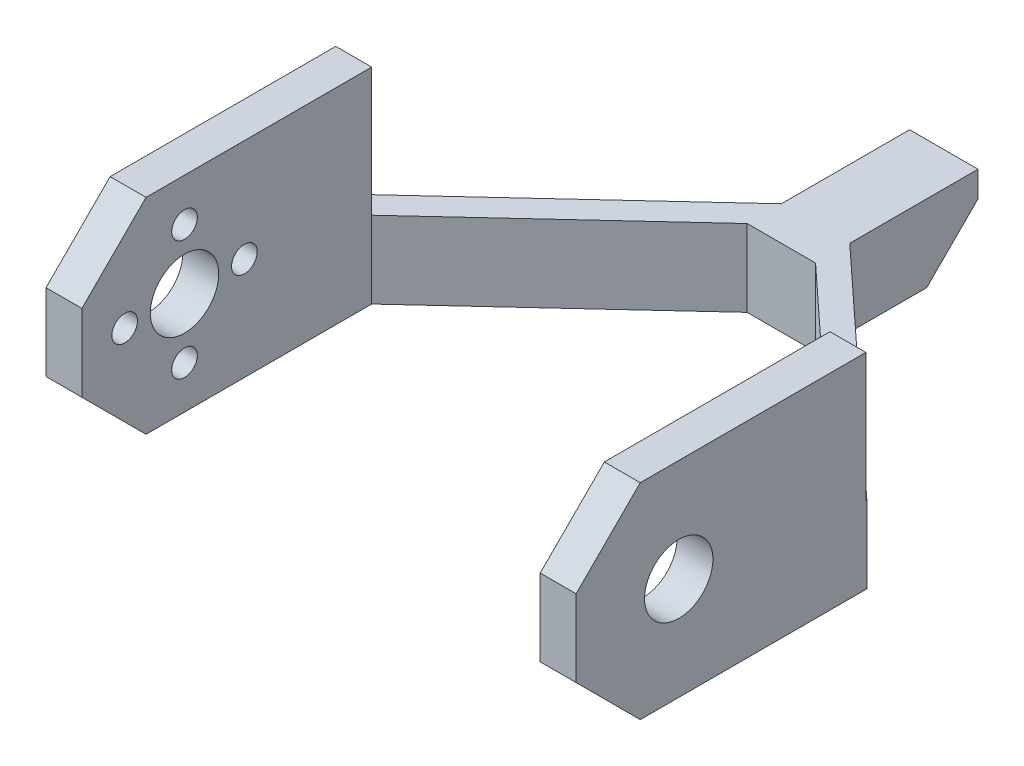
ISO-10303-21;
HEADER;
FILE_DESCRIPTION(('STEP AP214'),'2;1');
FILE_NAME('part.step','',(''),(''),'','','');
FILE_SCHEMA(('AUTOMOTIVE_DESIGN { 1 0 10303 214 1 1 1 1 }'));
ENDSEC;
DATA;
#1=APPLICATION_CONTEXT('core data for automotive mechanical design processes');
#2=APPLICATION_PROTOCOL_DEFINITION('international standard','automotive_design',2000,#1);
#3=PRODUCT_CONTEXT('',#1,'mechanical');
#4=PRODUCT('Part','Part','',(#3));
#5=PRODUCT_RELATED_PRODUCT_CATEGORY('part','',(#4));
#6=PRODUCT_DEFINITION_FORMATION('','',#4);
#7=PRODUCT_DEFINITION_CONTEXT('part definition',#1,'design');
#8=PRODUCT_DEFINITION('design','',#6,#7);
#9=PRODUCT_DEFINITION_SHAPE('','',#8);
#10=(LENGTH_UNIT() NAMED_UNIT(*) SI_UNIT(.MILLI.,.METRE.));
#11=(NAMED_UNIT(*) PLANE_ANGLE_UNIT() SI_UNIT($,.RADIAN.));
#12=(NAMED_UNIT(*) SI_UNIT($,.STERADIAN.) SOLID_ANGLE_UNIT());
#13=UNCERTAINTY_MEASURE_WITH_UNIT(LENGTH_MEASURE(1.E-05),#10,'distance_accuracy_value','');
#14=(GEOMETRIC_REPRESENTATION_CONTEXT(3) GLOBAL_UNCERTAINTY_ASSIGNED_CONTEXT((#13)) GLOBAL_UNIT_ASSIGNED_CONTEXT((#10,
#11,#12)) REPRESENTATION_CONTEXT('',''));
#15=CARTESIAN_POINT('',(0.,0.,0.));
#16=DIRECTION('',(0.,0.,1.));
#17=DIRECTION('',(1.,0.,0.));
#18=AXIS2_PLACEMENT_3D('',#15,#16,#17);
#19=CARTESIAN_POINT('',(-62.,12.,12.));
#20=DIRECTION('',(0.,1.,0.));
#21=DIRECTION('',(0.,0.,1.));
#22=AXIS2_PLACEMENT_3D('',#19,#20,#21);
#23=PLANE('',#22);
#24=DIRECTION('',(1.,0.,0.));
#25=VECTOR('',#24,1.);
#26=CARTESIAN_POINT('',(-57.8,12.,-21.8888888888889));
#27=LINE('',#26,#25);
#28=CARTESIAN_POINT('',(-62.,12.,-21.8888888888889));
#29=VERTEX_POINT('',#28);
#30=CARTESIAN_POINT('',(-57.8,12.,-21.8888888888889));
#31=VERTEX_POINT('',#30);
#32=EDGE_CURVE('E190',#29,#31,#27,.T.);
#33=ORIENTED_EDGE('',*,*,#32,.F.);
#34=DIRECTION('',(0.,0.,1.));
#35=VECTOR('',#34,1.);
#36=CARTESIAN_POINT('',(-62.,12.,-47.));
#37=LINE('',#36,#35);
#38=CARTESIAN_POINT('',(-62.,12.,4.50000000000001));
#39=VERTEX_POINT('',#38);
#40=EDGE_CURVE('E249',#29,#39,#37,.T.);
#41=ORIENTED_EDGE('',*,*,#40,.T.);
#42=DIRECTION('',(1.,0.,0.));
#43=VECTOR('',#42,1.);
#44=CARTESIAN_POINT('',(-62.,12.,4.50000000000001));
#45=LINE('',#44,#43);
#46=CARTESIAN_POINT('',(-57.8,12.,4.50000000000001));
#47=VERTEX_POINT('',#46);
#48=EDGE_CURVE('E274',#39,#47,#45,.T.);
#49=ORIENTED_EDGE('',*,*,#48,.T.);
#50=DIRECTION('',(0.,0.,1.));
#51=VECTOR('',#50,1.);
#52=CARTESIAN_POINT('',(-57.8,12.,12.));
#53=LINE('',#52,#51);
#54=EDGE_CURVE('E237',#31,#47,#53,.T.);
#55=ORIENTED_EDGE('',*,*,#54,.F.);
#56=EDGE_LOOP('',(#33,#41,#49,#55));
#57=FACE_BOUND('',#56,.T.);
#58=ADVANCED_FACE('F37',(#57),#23,.T.);
#59=CARTESIAN_POINT('',(-62.,12.,12.));
#60=DIRECTION('',(0.,0.,1.));
#61=DIRECTION('',(1.,0.,0.));
#62=AXIS2_PLACEMENT_3D('',#59,#60,#61);
#63=PLANE('',#62);
#64=DIRECTION('',(0.,1.,0.));
#65=VECTOR('',#64,1.);
#66=CARTESIAN_POINT('',(-57.8,-12.001,12.));
#67=LINE('',#66,#65);
#68=CARTESIAN_POINT('',(-57.8,-4.49999999999999,12.));
#69=VERTEX_POINT('',#68);
#70=CARTESIAN_POINT('',(-57.8,4.49999999999999,12.));
#71=VERTEX_POINT('',#70);
#72=EDGE_CURVE('E220',#69,#71,#67,.T.);
#73=ORIENTED_EDGE('',*,*,#72,.T.);
#74=DIRECTION('',(-1.,0.,0.));
#75=VECTOR('',#74,1.);
#76=CARTESIAN_POINT('',(-62.,4.5,12.));
#77=LINE('',#76,#75);
#78=CARTESIAN_POINT('',(-62.,4.5,12.));
#79=VERTEX_POINT('',#78);
#80=EDGE_CURVE('E301',#71,#79,#77,.T.);
#81=ORIENTED_EDGE('',*,*,#80,.T.);
#82=DIRECTION('',(0.,-1.,0.));
#83=VECTOR('',#82,1.);
#84=CARTESIAN_POINT('',(-62.,12.,12.));
#85=LINE('',#84,#83);
#86=CARTESIAN_POINT('',(-62.,-4.49999999999999,12.));
#87=VERTEX_POINT('',#86);
#88=EDGE_CURVE('E373',#79,#87,#85,.T.);
#89=ORIENTED_EDGE('',*,*,#88,.T.);
#90=DIRECTION('',(1.,0.,0.));
#91=VECTOR('',#90,1.);
#92=CARTESIAN_POINT('',(-62.,-4.5,12.));
#93=LINE('',#92,#91);
#94=EDGE_CURVE('E298',#87,#69,#93,.T.);
#95=ORIENTED_EDGE('',*,*,#94,.T.);
#96=EDGE_LOOP('',(#73,#81,#89,#95));
#97=FACE_BOUND('',#96,.T.);
#98=ADVANCED_FACE('F372',(#97),#63,.T.);
#99=CARTESIAN_POINT('',(-62.,-12.,-12.));
#100=DIRECTION('',(0.,-1.,0.));
#101=DIRECTION('',(0.,0.,-1.));
#102=AXIS2_PLACEMENT_3D('',#99,#100,#101);
#103=PLANE('',#102);
#104=DIRECTION('',(0.,0.,1.));
#105=VECTOR('',#104,1.);
#106=CARTESIAN_POINT('',(-35.,-12.,-47.));
#107=LINE('',#106,#105);
#108=CARTESIAN_POINT('',(-35.,-12.,-56.));
#109=VERTEX_POINT('',#108);
#110=CARTESIAN_POINT('',(-35.,-12.,-47.));
#111=VERTEX_POINT('',#110);
#112=EDGE_CURVE('E336',#109,#111,#107,.T.);
#113=ORIENTED_EDGE('',*,*,#112,.F.);
#114=DIRECTION('',(1.,0.,0.));
#115=VECTOR('',#114,1.);
#116=CARTESIAN_POINT('',(-62.,-12.,-56.));
#117=LINE('',#116,#115);
#118=CARTESIAN_POINT('',(-27.,-12.,-56.));
#119=VERTEX_POINT('',#118);
#120=EDGE_CURVE('E45',#109,#119,#117,.T.);
#121=ORIENTED_EDGE('',*,*,#120,.T.);
#122=DIRECTION('',(0.,0.,-1.));
#123=VECTOR('',#122,1.);
#124=CARTESIAN_POINT('',(-27.,-12.,-47.));
#125=LINE('',#124,#123);
#126=CARTESIAN_POINT('',(-27.,-12.,-47.));
#127=VERTEX_POINT('',#126);
#128=EDGE_CURVE('E340',#127,#119,#125,.T.);
#129=ORIENTED_EDGE('',*,*,#128,.F.);
#130=DIRECTION('',(0.733760674018169,0.,0.679408031498305));
#131=VECTOR('',#130,1.);
#132=CARTESIAN_POINT('',(-27.,-12.,-47.));
#133=LINE('',#132,#131);
#134=CARTESIAN_POINT('',(0.,-12.,-22.));
#135=VERTEX_POINT('',#134);
#136=EDGE_CURVE('E338',#127,#135,#133,.T.);
#137=ORIENTED_EDGE('',*,*,#136,.T.);
#138=DIRECTION('',(0.,0.,-1.));
#139=VECTOR('',#138,1.);
#140=CARTESIAN_POINT('',(0.,-12.,-12.));
#141=LINE('',#140,#139);
#142=CARTESIAN_POINT('',(0.,-12.,4.49999999999997));
#143=VERTEX_POINT('',#142);
#144=EDGE_CURVE('E380',#143,#135,#141,.T.);
#145=ORIENTED_EDGE('',*,*,#144,.F.);
#146=DIRECTION('',(-1.,0.,0.));
#147=VECTOR('',#146,1.);
#148=CARTESIAN_POINT('',(-62.,-12.,4.49999999999997));
#149=LINE('',#148,#147);
#150=CARTESIAN_POINT('',(-4.2,-12.,4.49999999999997));
#151=VERTEX_POINT('',#150);
#152=EDGE_CURVE('E310',#143,#151,#149,.T.);
#153=ORIENTED_EDGE('',*,*,#152,.T.);
#154=DIRECTION('',(0.,0.,-1.));
#155=VECTOR('',#154,1.);
#156=CARTESIAN_POINT('',(-4.2,-12.,-21.8888888888889));
#157=LINE('',#156,#155);
#158=CARTESIAN_POINT('',(-4.2,-12.,-21.8888888888889));
#159=VERTEX_POINT('',#158);
#160=EDGE_CURVE('E223',#151,#159,#157,.T.);
#161=ORIENTED_EDGE('',*,*,#160,.T.);
#162=DIRECTION('',(-0.73376067401817,0.,-0.679408031498305));
#163=VECTOR('',#162,1.);
#164=CARTESIAN_POINT('',(-27.,-12.,-43.));
#165=LINE('',#164,#163);
#166=CARTESIAN_POINT('',(-27.,-12.,-43.));
#167=VERTEX_POINT('',#166);
#168=EDGE_CURVE('E350',#159,#167,#165,.T.);
#169=ORIENTED_EDGE('',*,*,#168,.T.);
#170=DIRECTION('',(-1.,0.,0.));
#171=VECTOR('',#170,1.);
#172=CARTESIAN_POINT('',(-35.,-12.,-43.));
#173=LINE('',#172,#171);
#174=CARTESIAN_POINT('',(-35.,-12.,-43.));
#175=VERTEX_POINT('',#174);
#176=EDGE_CURVE('E353',#167,#175,#173,.T.);
#177=ORIENTED_EDGE('',*,*,#176,.T.);
#178=DIRECTION('',(-0.733760674018169,0.,0.679408031498305));
#179=VECTOR('',#178,1.);
#180=CARTESIAN_POINT('',(-35.,-12.,-43.));
#181=LINE('',#180,#179);
#182=CARTESIAN_POINT('',(-57.8,-12.,-21.8888888888889));
#183=VERTEX_POINT('',#182);
#184=EDGE_CURVE('E356',#175,#183,#181,.T.);
#185=ORIENTED_EDGE('',*,*,#184,.T.);
#186=DIRECTION('',(0.,0.,1.));
#187=VECTOR('',#186,1.);
#188=CARTESIAN_POINT('',(-57.8,-12.,12.));
#189=LINE('',#188,#187);
#190=CARTESIAN_POINT('',(-57.8,-12.,4.49999999999997));
#191=VERTEX_POINT('',#190);
#192=EDGE_CURVE('E219',#183,#191,#189,.T.);
#193=ORIENTED_EDGE('',*,*,#192,.T.);
#194=DIRECTION('',(-1.,0.,0.));
#195=VECTOR('',#194,1.);
#196=CARTESIAN_POINT('',(-62.,-12.,4.49999999999997));
#197=LINE('',#196,#195);
#198=CARTESIAN_POINT('',(-62.,-12.,4.49999999999997));
#199=VERTEX_POINT('',#198);
#200=EDGE_CURVE('E308',#191,#199,#197,.T.);
#201=ORIENTED_EDGE('',*,*,#200,.T.);
#202=DIRECTION('',(0.,0.,-1.));
#203=VECTOR('',#202,1.);
#204=CARTESIAN_POINT('',(-62.,-12.,12.));
#205=LINE('',#204,#203);
#206=CARTESIAN_POINT('',(-62.,-12.,-22.));
#207=VERTEX_POINT('',#206);
#208=EDGE_CURVE('E278',#199,#207,#205,.T.);
#209=ORIENTED_EDGE('',*,*,#208,.T.);
#210=DIRECTION('',(0.733760674018169,0.,-0.679408031498305));
#211=VECTOR('',#210,1.);
#212=CARTESIAN_POINT('',(-35.,-12.,-47.));
#213=LINE('',#212,#211);
#214=EDGE_CURVE('E239',#207,#111,#213,.T.);
#215=ORIENTED_EDGE('',*,*,#214,.T.);
#216=EDGE_LOOP('',(#113,#121,#129,#137,#145,#153,#161,#169,#177,#185,#193,#201,#209,#215));
#217=FACE_BOUND('',#216,.T.);
#218=ADVANCED_FACE('F396',(#217),#103,.T.);
#219=DIRECTION('',(0.,-1.,0.));
#220=VECTOR('',#219,1.);
#221=CARTESIAN_POINT('',(0.,12.,12.));
#222=LINE('',#221,#220);
#223=CARTESIAN_POINT('',(0.,4.5,12.));
#224=VERTEX_POINT('',#223);
#225=CARTESIAN_POINT('',(0.,-4.49999999999999,12.));
#226=VERTEX_POINT('',#225);
#227=EDGE_CURVE('E383',#224,#226,#222,.T.);
#228=ORIENTED_EDGE('',*,*,#227,.F.);
#229=DIRECTION('',(-1.,0.,0.));
#230=VECTOR('',#229,1.);
#231=CARTESIAN_POINT('',(-62.,4.5,12.));
#232=LINE('',#231,#230);
#233=CARTESIAN_POINT('',(-4.19999999999999,4.49999999999998,12.));
#234=VERTEX_POINT('',#233);
#235=EDGE_CURVE('E288',#224,#234,#232,.T.);
#236=ORIENTED_EDGE('',*,*,#235,.T.);
#237=DIRECTION('',(0.,1.,0.));
#238=VECTOR('',#237,1.);
#239=CARTESIAN_POINT('',(-4.2,-12.001,12.));
#240=LINE('',#239,#238);
#241=CARTESIAN_POINT('',(-4.2,-4.49999999999999,12.));
#242=VERTEX_POINT('',#241);
#243=EDGE_CURVE('E234',#242,#234,#240,.T.);
#244=ORIENTED_EDGE('',*,*,#243,.F.);
#245=DIRECTION('',(1.,0.,0.));
#246=VECTOR('',#245,1.);
#247=CARTESIAN_POINT('',(-62.,-4.5,12.));
#248=LINE('',#247,#246);
#249=EDGE_CURVE('E285',#242,#226,#248,.T.);
#250=ORIENTED_EDGE('',*,*,#249,.T.);
#251=EDGE_LOOP('',(#228,#236,#244,#250));
#252=FACE_BOUND('',#251,.T.);
#253=ADVANCED_FACE('F466',(#252),#63,.T.);
#254=DIRECTION('',(1.,0.,0.));
#255=VECTOR('',#254,1.);
#256=CARTESIAN_POINT('',(-4.2,12.,-21.8888888888889));
#257=LINE('',#256,#255);
#258=CARTESIAN_POINT('',(-4.2,12.,-21.8888888888889));
#259=VERTEX_POINT('',#258);
#260=CARTESIAN_POINT('',(0.,12.,-21.8888888888889));
#261=VERTEX_POINT('',#260);
#262=EDGE_CURVE('E205',#259,#261,#257,.T.);
#263=ORIENTED_EDGE('',*,*,#262,.F.);
#264=DIRECTION('',(0.,0.,-1.));
#265=VECTOR('',#264,1.);
#266=CARTESIAN_POINT('',(-4.2,12.,-21.8888888888889));
#267=LINE('',#266,#265);
#268=CARTESIAN_POINT('',(-4.2,12.,4.5));
#269=VERTEX_POINT('',#268);
#270=EDGE_CURVE('E359',#269,#259,#267,.T.);
#271=ORIENTED_EDGE('',*,*,#270,.F.);
#272=DIRECTION('',(1.,0.,0.));
#273=VECTOR('',#272,1.);
#274=CARTESIAN_POINT('',(-62.,12.,4.50000000000001));
#275=LINE('',#274,#273);
#276=CARTESIAN_POINT('',(0.,12.,4.50000000000001));
#277=VERTEX_POINT('',#276);
#278=EDGE_CURVE('E277',#269,#277,#275,.T.);
#279=ORIENTED_EDGE('',*,*,#278,.T.);
#280=DIRECTION('',(0.,0.,1.));
#281=VECTOR('',#280,1.);
#282=CARTESIAN_POINT('',(0.,12.,12.));
#283=LINE('',#282,#281);
#284=EDGE_CURVE('E246',#261,#277,#283,.T.);
#285=ORIENTED_EDGE('',*,*,#284,.F.);
#286=EDGE_LOOP('',(#263,#271,#279,#285));
#287=FACE_BOUND('',#286,.T.);
#288=ADVANCED_FACE('F458',(#287),#23,.T.);
#289=CARTESIAN_POINT('',(-62.,0.,0.));
#290=DIRECTION('',(1.,0.,0.));
#291=DIRECTION('',(0.,0.,-1.));
#292=AXIS2_PLACEMENT_3D('',#289,#290,#291);
#293=PLANE('',#292);
#294=CARTESIAN_POINT('',(-62.,-1.98951966012828E-13,-6.9999999999998));
#295=DIRECTION('',(-1.,0.,0.));
#296=DIRECTION('',(0.,0.,1.));
#297=AXIS2_PLACEMENT_3D('',#294,#295,#296);
#298=CIRCLE('',#297,1.50000000000032);
#299=CARTESIAN_POINT('',(-62.,-1.98951966012828E-13,-5.49999999999948));
#300=VERTEX_POINT('',#299);
#301=EDGE_CURVE('E430',#300,#300,#298,.T.);
#302=ORIENTED_EDGE('',*,*,#301,.F.);
#303=EDGE_LOOP('',(#302));
#304=FACE_BOUND('',#303,.T.);
#305=CARTESIAN_POINT('',(-62.,-7.,3.9618942650685E-13));
#306=DIRECTION('',(-1.,0.,0.));
#307=DIRECTION('',(0.,0.,1.));
#308=AXIS2_PLACEMENT_3D('',#305,#306,#307);
#309=CIRCLE('',#308,1.50000000000043);
#310=CARTESIAN_POINT('',(-62.,-7.,1.50000000000082));
#311=VERTEX_POINT('',#310);
#312=EDGE_CURVE('E424',#311,#311,#309,.T.);
#313=ORIENTED_EDGE('',*,*,#312,.F.);
#314=EDGE_LOOP('',(#313));
#315=FACE_BOUND('',#314,.T.);
#316=CARTESIAN_POINT('',(-62.,1.98094713253425E-13,7.0000000000002));
#317=DIRECTION('',(-1.,0.,0.));
#318=DIRECTION('',(0.,0.,1.));
#319=AXIS2_PLACEMENT_3D('',#316,#317,#318);
#320=CIRCLE('',#319,1.50000000000015);
#321=CARTESIAN_POINT('',(-62.,1.98094713253425E-13,8.50000000000035));
#322=VERTEX_POINT('',#321);
#323=EDGE_CURVE('E418',#322,#322,#320,.T.);
#324=ORIENTED_EDGE('',*,*,#323,.F.);
#325=EDGE_LOOP('',(#324));
#326=FACE_BOUND('',#325,.T.);
#327=CARTESIAN_POINT('',(-62.,7.,0.));
#328=DIRECTION('',(-1.,0.,0.));
#329=DIRECTION('',(0.,0.,1.));
#330=AXIS2_PLACEMENT_3D('',#327,#328,#329);
#331=CIRCLE('',#330,1.5);
#332=CARTESIAN_POINT('',(-62.,7.,1.5));
#333=VERTEX_POINT('',#332);
#334=EDGE_CURVE('E412',#333,#333,#331,.T.);
#335=ORIENTED_EDGE('',*,*,#334,.F.);
#336=EDGE_LOOP('',(#335));
#337=FACE_BOUND('',#336,.T.);
#338=CARTESIAN_POINT('',(-62.,0.,0.));
#339=DIRECTION('',(1.,0.,0.));
#340=DIRECTION('',(0.,0.,-1.));
#341=AXIS2_PLACEMENT_3D('',#338,#339,#340);
#342=CIRCLE('',#341,4.);
#343=CARTESIAN_POINT('',(-62.,0.,-4.));
#344=VERTEX_POINT('',#343);
#345=EDGE_CURVE('E266',#344,#344,#342,.T.);
#346=ORIENTED_EDGE('',*,*,#345,.T.);
#347=EDGE_LOOP('',(#346));
#348=FACE_BOUND('',#347,.T.);
#349=DIRECTION('',(0.,1.,0.));
#350=VECTOR('',#349,1.);
#351=CARTESIAN_POINT('',(-62.,-69.8922110655237,-21.8888888888889));
#352=LINE('',#351,#350);
#353=CARTESIAN_POINT('',(-62.,-3.,-21.8888888888889));
#354=VERTEX_POINT('',#353);
#355=EDGE_CURVE('E433',#354,#29,#352,.T.);
#356=ORIENTED_EDGE('',*,*,#355,.F.);
#357=DIRECTION('',(0.,0.,1.));
#358=VECTOR('',#357,1.);
#359=CARTESIAN_POINT('',(-62.,-3.,-21.8888888888889));
#360=LINE('',#359,#358);
#361=CARTESIAN_POINT('',(-62.,-3.,-22.));
#362=VERTEX_POINT('',#361);
#363=EDGE_CURVE('E203',#362,#354,#360,.T.);
#364=ORIENTED_EDGE('',*,*,#363,.F.);
#365=DIRECTION('',(0.,1.,0.));
#366=VECTOR('',#365,1.);
#367=CARTESIAN_POINT('',(-62.,-12.001,-22.));
#368=LINE('',#367,#366);
#369=EDGE_CURVE('E243',#207,#362,#368,.T.);
#370=ORIENTED_EDGE('',*,*,#369,.F.);
#371=ORIENTED_EDGE('',*,*,#208,.F.);
#372=DIRECTION('',(0.,-0.707106781186546,-0.707106781186549));
#373=VECTOR('',#372,1.);
#374=CARTESIAN_POINT('',(-62.,-4.5,12.));
#375=LINE('',#374,#373);
#376=EDGE_CURVE('E303',#199,#87,#375,.F.);
#377=ORIENTED_EDGE('',*,*,#376,.T.);
#378=ORIENTED_EDGE('',*,*,#88,.F.);
#379=DIRECTION('',(0.,-0.707106781186548,0.707106781186547));
#380=VECTOR('',#379,1.);
#381=CARTESIAN_POINT('',(-62.,12.,4.50000000000001));
#382=LINE('',#381,#380);
#383=EDGE_CURVE('E305',#79,#39,#382,.F.);
#384=ORIENTED_EDGE('',*,*,#383,.T.);
#385=ORIENTED_EDGE('',*,*,#40,.F.);
#386=EDGE_LOOP('',(#356,#364,#370,#371,#377,#378,#384,#385));
#387=FACE_BOUND('',#386,.T.);
#388=ADVANCED_FACE('F376',(#304,#315,#326,#337,#348,#387),#293,.F.);
#389=CARTESIAN_POINT('',(0.,0.,0.));
#390=DIRECTION('',(1.,0.,0.));
#391=DIRECTION('',(0.,0.,-1.));
#392=AXIS2_PLACEMENT_3D('',#389,#390,#391);
#393=PLANE('',#392);
#394=DIRECTION('',(0.,0.,-1.));
#395=VECTOR('',#394,1.);
#396=CARTESIAN_POINT('',(0.,-3.,-21.8888888888889));
#397=LINE('',#396,#395);
#398=CARTESIAN_POINT('',(0.,-3.,-21.8888888888889));
#399=VERTEX_POINT('',#398);
#400=CARTESIAN_POINT('',(0.,-3.,-22.));
#401=VERTEX_POINT('',#400);
#402=EDGE_CURVE('E316',#399,#401,#397,.T.);
#403=ORIENTED_EDGE('',*,*,#402,.F.);
#404=DIRECTION('',(0.,1.,0.));
#405=VECTOR('',#404,1.);
#406=CARTESIAN_POINT('',(0.,-69.8922110655237,-21.8888888888889));
#407=LINE('',#406,#405);
#408=EDGE_CURVE('E439',#399,#261,#407,.T.);
#409=ORIENTED_EDGE('',*,*,#408,.T.);
#410=ORIENTED_EDGE('',*,*,#284,.T.);
#411=DIRECTION('',(0.,0.707106781186548,-0.707106781186547));
#412=VECTOR('',#411,1.);
#413=CARTESIAN_POINT('',(0.,8.24999999999999,8.25000000000001));
#414=LINE('',#413,#412);
#415=EDGE_CURVE('E283',#277,#224,#414,.F.);
#416=ORIENTED_EDGE('',*,*,#415,.T.);
#417=ORIENTED_EDGE('',*,*,#227,.T.);
#418=DIRECTION('',(0.,0.707106781186546,0.707106781186549));
#419=VECTOR('',#418,1.);
#420=CARTESIAN_POINT('',(0.,-8.25000000000001,8.24999999999998));
#421=LINE('',#420,#419);
#422=EDGE_CURVE('E281',#226,#143,#421,.F.);
#423=ORIENTED_EDGE('',*,*,#422,.T.);
#424=ORIENTED_EDGE('',*,*,#144,.T.);
#425=DIRECTION('',(0.,1.,0.));
#426=VECTOR('',#425,1.);
#427=CARTESIAN_POINT('',(0.,-12.001,-22.));
#428=LINE('',#427,#426);
#429=EDGE_CURVE('E345',#135,#401,#428,.T.);
#430=ORIENTED_EDGE('',*,*,#429,.T.);
#431=EDGE_LOOP('',(#403,#409,#410,#416,#417,#423,#424,#430));
#432=FACE_BOUND('',#431,.T.);
#433=CARTESIAN_POINT('',(0.,0.,0.));
#434=DIRECTION('',(1.,0.,0.));
#435=DIRECTION('',(0.,0.,-1.));
#436=AXIS2_PLACEMENT_3D('',#433,#434,#435);
#437=CIRCLE('',#436,4.);
#438=CARTESIAN_POINT('',(0.,0.,-4.));
#439=VERTEX_POINT('',#438);
#440=EDGE_CURVE('E273',#439,#439,#437,.T.);
#441=ORIENTED_EDGE('',*,*,#440,.F.);
#442=EDGE_LOOP('',(#441));
#443=FACE_BOUND('',#442,.T.);
#444=ADVANCED_FACE('F389',(#432,#443),#393,.T.);
#445=CARTESIAN_POINT('',(-35.,-12.001,-47.));
#446=DIRECTION('',(0.679408031498305,0.,0.733760674018169));
#447=DIRECTION('',(0.733760674018169,0.,-0.679408031498305));
#448=AXIS2_PLACEMENT_3D('',#445,#446,#447);
#449=PLANE('',#448);
#450=ORIENTED_EDGE('',*,*,#369,.T.);
#451=DIRECTION('',(-0.733760674018169,0.,0.679408031498305));
#452=VECTOR('',#451,1.);
#453=CARTESIAN_POINT('',(-62.,-3.,-22.));
#454=LINE('',#453,#452);
#455=CARTESIAN_POINT('',(-35.,-3.,-47.));
#456=VERTEX_POINT('',#455);
#457=EDGE_CURVE('E315',#456,#362,#454,.T.);
#458=ORIENTED_EDGE('',*,*,#457,.F.);
#459=DIRECTION('',(0.,1.,0.));
#460=VECTOR('',#459,1.);
#461=CARTESIAN_POINT('',(-35.,-12.001,-47.));
#462=LINE('',#461,#460);
#463=EDGE_CURVE('E242',#111,#456,#462,.T.);
#464=ORIENTED_EDGE('',*,*,#463,.F.);
#465=ORIENTED_EDGE('',*,*,#214,.F.);
#466=EDGE_LOOP('',(#450,#458,#464,#465));
#467=FACE_BOUND('',#466,.T.);
#468=ADVANCED_FACE('F511',(#467),#449,.F.);
#469=CARTESIAN_POINT('',(-57.8,-12.001,12.));
#470=DIRECTION('',(-1.,0.,0.));
#471=DIRECTION('',(0.,0.,1.));
#472=AXIS2_PLACEMENT_3D('',#469,#470,#471);
#473=PLANE('',#472);
#474=CARTESIAN_POINT('',(-57.8,-1.98951966012828E-13,-6.9999999999998));
#475=DIRECTION('',(-1.,0.,0.));
#476=DIRECTION('',(0.,0.,1.));
#477=AXIS2_PLACEMENT_3D('',#474,#475,#476);
#478=CIRCLE('',#477,1.50000000000032);
#479=CARTESIAN_POINT('',(-57.8,-1.98951966012828E-13,-5.49999999999948));
#480=VERTEX_POINT('',#479);
#481=EDGE_CURVE('E427',#480,#480,#478,.F.);
#482=ORIENTED_EDGE('',*,*,#481,.F.);
#483=EDGE_LOOP('',(#482));
#484=FACE_BOUND('',#483,.T.);
#485=CARTESIAN_POINT('',(-57.8,-7.,3.9618942650685E-13));
#486=DIRECTION('',(-1.,0.,0.));
#487=DIRECTION('',(0.,0.,1.));
#488=AXIS2_PLACEMENT_3D('',#485,#486,#487);
#489=CIRCLE('',#488,1.50000000000043);
#490=CARTESIAN_POINT('',(-57.8,-7.,1.50000000000082));
#491=VERTEX_POINT('',#490);
#492=EDGE_CURVE('E421',#491,#491,#489,.F.);
#493=ORIENTED_EDGE('',*,*,#492,.F.);
#494=EDGE_LOOP('',(#493));
#495=FACE_BOUND('',#494,.T.);
#496=CARTESIAN_POINT('',(-57.8,1.98094713253425E-13,7.0000000000002));
#497=DIRECTION('',(-1.,0.,0.));
#498=DIRECTION('',(0.,0.,1.));
#499=AXIS2_PLACEMENT_3D('',#496,#497,#498);
#500=CIRCLE('',#499,1.50000000000015);
#501=CARTESIAN_POINT('',(-57.8,1.98094713253425E-13,8.50000000000035));
#502=VERTEX_POINT('',#501);
#503=EDGE_CURVE('E415',#502,#502,#500,.F.);
#504=ORIENTED_EDGE('',*,*,#503,.F.);
#505=EDGE_LOOP('',(#504));
#506=FACE_BOUND('',#505,.T.);
#507=CARTESIAN_POINT('',(-57.8,7.,0.));
#508=DIRECTION('',(-1.,0.,0.));
#509=DIRECTION('',(0.,0.,1.));
#510=AXIS2_PLACEMENT_3D('',#507,#508,#509);
#511=CIRCLE('',#510,1.5);
#512=CARTESIAN_POINT('',(-57.8,7.,1.5));
#513=VERTEX_POINT('',#512);
#514=EDGE_CURVE('E409',#513,#513,#511,.F.);
#515=ORIENTED_EDGE('',*,*,#514,.F.);
#516=EDGE_LOOP('',(#515));
#517=FACE_BOUND('',#516,.T.);
#518=CARTESIAN_POINT('',(-57.8,0.,0.));
#519=DIRECTION('',(-1.,0.,0.));
#520=DIRECTION('',(0.,0.,1.));
#521=AXIS2_PLACEMENT_3D('',#518,#519,#520);
#522=CIRCLE('',#521,4.);
#523=CARTESIAN_POINT('',(-57.8,0.,4.));
#524=VERTEX_POINT('',#523);
#525=EDGE_CURVE('E272',#524,#524,#522,.T.);
#526=ORIENTED_EDGE('',*,*,#525,.T.);
#527=EDGE_LOOP('',(#526));
#528=FACE_BOUND('',#527,.T.);
#529=ORIENTED_EDGE('',*,*,#54,.T.);
#530=DIRECTION('',(0.,0.707106781186548,-0.707106781186547));
#531=VECTOR('',#530,1.);
#532=CARTESIAN_POINT('',(-57.8,12.,4.50000000000001));
#533=LINE('',#532,#531);
#534=EDGE_CURVE('E296',#47,#71,#533,.F.);
#535=ORIENTED_EDGE('',*,*,#534,.T.);
#536=ORIENTED_EDGE('',*,*,#72,.F.);
#537=DIRECTION('',(0.,0.707106781186546,0.707106781186549));
#538=VECTOR('',#537,1.);
#539=CARTESIAN_POINT('',(-57.8,-4.5,12.));
#540=LINE('',#539,#538);
#541=EDGE_CURVE('E294',#69,#191,#540,.F.);
#542=ORIENTED_EDGE('',*,*,#541,.T.);
#543=ORIENTED_EDGE('',*,*,#192,.F.);
#544=DIRECTION('',(0.,1.,0.));
#545=VECTOR('',#544,1.);
#546=CARTESIAN_POINT('',(-57.8,-12.001,-21.8888888888889));
#547=LINE('',#546,#545);
#548=CARTESIAN_POINT('',(-57.8,-3.00000000000003,-21.8888888888889));
#549=VERTEX_POINT('',#548);
#550=EDGE_CURVE('E211',#183,#549,#547,.T.);
#551=ORIENTED_EDGE('',*,*,#550,.T.);
#552=DIRECTION('',(0.,1.,0.));
#553=VECTOR('',#552,1.);
#554=CARTESIAN_POINT('',(-57.8,-69.8922110655237,-21.8888888888889));
#555=LINE('',#554,#553);
#556=EDGE_CURVE('E184',#549,#31,#555,.T.);
#557=ORIENTED_EDGE('',*,*,#556,.T.);
#558=EDGE_LOOP('',(#529,#535,#536,#542,#543,#551,#557));
#559=FACE_BOUND('',#558,.T.);
#560=ADVANCED_FACE('F217',(#484,#495,#506,#517,#528,#559),#473,.F.);
#561=CARTESIAN_POINT('',(-35.,-12.001,-43.));
#562=DIRECTION('',(-0.679408031498305,0.,-0.733760674018169));
#563=DIRECTION('',(-0.733760674018169,0.,0.679408031498305));
#564=AXIS2_PLACEMENT_3D('',#561,#562,#563);
#565=PLANE('',#564);
#566=DIRECTION('',(0.,1.,0.));
#567=VECTOR('',#566,1.);
#568=CARTESIAN_POINT('',(-35.,-12.001,-43.));
#569=LINE('',#568,#567);
#570=CARTESIAN_POINT('',(-35.,-3.,-43.));
#571=VERTEX_POINT('',#570);
#572=EDGE_CURVE('E214',#175,#571,#569,.T.);
#573=ORIENTED_EDGE('',*,*,#572,.T.);
#574=DIRECTION('',(0.733760674018169,0.,-0.679408031498305));
#575=VECTOR('',#574,1.);
#576=CARTESIAN_POINT('',(-35.,-3.,-43.));
#577=LINE('',#576,#575);
#578=EDGE_CURVE('E195',#549,#571,#577,.T.);
#579=ORIENTED_EDGE('',*,*,#578,.F.);
#580=ORIENTED_EDGE('',*,*,#550,.F.);
#581=ORIENTED_EDGE('',*,*,#184,.F.);
#582=EDGE_LOOP('',(#573,#579,#580,#581));
#583=FACE_BOUND('',#582,.T.);
#584=ADVANCED_FACE('F210',(#583),#565,.F.);
#585=CARTESIAN_POINT('',(-35.,-12.001,-43.));
#586=DIRECTION('',(0.,0.,-1.));
#587=DIRECTION('',(-1.,0.,0.));
#588=AXIS2_PLACEMENT_3D('',#585,#586,#587);
#589=PLANE('',#588);
#590=DIRECTION('',(0.,1.,0.));
#591=VECTOR('',#590,1.);
#592=CARTESIAN_POINT('',(-27.,-12.001,-43.));
#593=LINE('',#592,#591);
#594=CARTESIAN_POINT('',(-27.,-3.,-43.));
#595=VERTEX_POINT('',#594);
#596=EDGE_CURVE('E225',#167,#595,#593,.T.);
#597=ORIENTED_EDGE('',*,*,#596,.T.);
#598=DIRECTION('',(1.,0.,0.));
#599=VECTOR('',#598,1.);
#600=CARTESIAN_POINT('',(-27.,-3.,-43.));
#601=LINE('',#600,#599);
#602=EDGE_CURVE('E215',#571,#595,#601,.T.);
#603=ORIENTED_EDGE('',*,*,#602,.F.);
#604=ORIENTED_EDGE('',*,*,#572,.F.);
#605=ORIENTED_EDGE('',*,*,#176,.F.);
#606=EDGE_LOOP('',(#597,#603,#604,#605));
#607=FACE_BOUND('',#606,.T.);
#608=ADVANCED_FACE('F482',(#607),#589,.F.);
#609=CARTESIAN_POINT('',(-27.,-12.001,-43.));
#610=DIRECTION('',(0.679408031498305,0.,-0.73376067401817));
#611=DIRECTION('',(-0.73376067401817,0.,-0.679408031498305));
#612=AXIS2_PLACEMENT_3D('',#609,#610,#611);
#613=PLANE('',#612);
#614=DIRECTION('',(0.,1.,0.));
#615=VECTOR('',#614,1.);
#616=CARTESIAN_POINT('',(-4.2,-12.001,-21.8888888888889));
#617=LINE('',#616,#615);
#618=CARTESIAN_POINT('',(-4.2,-3.,-21.8888888888889));
#619=VERTEX_POINT('',#618);
#620=EDGE_CURVE('E231',#159,#619,#617,.T.);
#621=ORIENTED_EDGE('',*,*,#620,.T.);
#622=DIRECTION('',(0.73376067401817,0.,0.679408031498305));
#623=VECTOR('',#622,1.);
#624=CARTESIAN_POINT('',(-4.2,-3.,-21.8888888888889));
#625=LINE('',#624,#623);
#626=EDGE_CURVE('E438',#595,#619,#625,.T.);
#627=ORIENTED_EDGE('',*,*,#626,.F.);
#628=ORIENTED_EDGE('',*,*,#596,.F.);
#629=ORIENTED_EDGE('',*,*,#168,.F.);
#630=EDGE_LOOP('',(#621,#627,#628,#629));
#631=FACE_BOUND('',#630,.T.);
#632=ADVANCED_FACE('F479',(#631),#613,.F.);
#633=CARTESIAN_POINT('',(-4.2,-12.001,-21.8888888888889));
#634=DIRECTION('',(1.,0.,0.));
#635=DIRECTION('',(0.,0.,-1.));
#636=AXIS2_PLACEMENT_3D('',#633,#634,#635);
#637=PLANE('',#636);
#638=CARTESIAN_POINT('',(-4.20000000000001,0.,0.));
#639=DIRECTION('',(1.,0.,0.));
#640=DIRECTION('',(0.,0.,-1.));
#641=AXIS2_PLACEMENT_3D('',#638,#639,#640);
#642=CIRCLE('',#641,4.);
#643=CARTESIAN_POINT('',(-4.20000000000001,0.,-4.));
#644=VERTEX_POINT('',#643);
#645=EDGE_CURVE('E269',#644,#644,#642,.T.);
#646=ORIENTED_EDGE('',*,*,#645,.T.);
#647=EDGE_LOOP('',(#646));
#648=FACE_BOUND('',#647,.T.);
#649=ORIENTED_EDGE('',*,*,#243,.T.);
#650=DIRECTION('',(0.,-0.707106781186548,0.707106781186547));
#651=VECTOR('',#650,1.);
#652=CARTESIAN_POINT('',(-4.2,12.,4.5));
#653=LINE('',#652,#651);
#654=EDGE_CURVE('E292',#234,#269,#653,.F.);
#655=ORIENTED_EDGE('',*,*,#654,.T.);
#656=ORIENTED_EDGE('',*,*,#270,.T.);
#657=DIRECTION('',(0.,1.,0.));
#658=VECTOR('',#657,1.);
#659=CARTESIAN_POINT('',(-4.2,-69.8922110655237,-21.8888888888889));
#660=LINE('',#659,#658);
#661=EDGE_CURVE('E435',#619,#259,#660,.T.);
#662=ORIENTED_EDGE('',*,*,#661,.F.);
#663=ORIENTED_EDGE('',*,*,#620,.F.);
#664=ORIENTED_EDGE('',*,*,#160,.F.);
#665=DIRECTION('',(0.,-0.707106781186546,-0.707106781186549));
#666=VECTOR('',#665,1.);
#667=CARTESIAN_POINT('',(-4.2,-4.5,12.));
#668=LINE('',#667,#666);
#669=EDGE_CURVE('E290',#151,#242,#668,.F.);
#670=ORIENTED_EDGE('',*,*,#669,.T.);
#671=EDGE_LOOP('',(#649,#655,#656,#662,#663,#664,#670));
#672=FACE_BOUND('',#671,.T.);
#673=ADVANCED_FACE('F476',(#648,#672),#637,.F.);
#674=CARTESIAN_POINT('',(-27.,-12.001,-47.));
#675=DIRECTION('',(-0.679408031498305,0.,0.733760674018169));
#676=DIRECTION('',(0.733760674018169,0.,0.679408031498305));
#677=AXIS2_PLACEMENT_3D('',#674,#675,#676);
#678=PLANE('',#677);
#679=DIRECTION('',(0.,1.,0.));
#680=VECTOR('',#679,1.);
#681=CARTESIAN_POINT('',(-27.,-12.001,-47.));
#682=LINE('',#681,#680);
#683=CARTESIAN_POINT('',(-27.,-3.,-47.));
#684=VERTEX_POINT('',#683);
#685=EDGE_CURVE('E255',#127,#684,#682,.T.);
#686=ORIENTED_EDGE('',*,*,#685,.T.);
#687=DIRECTION('',(-0.733760674018169,0.,-0.679408031498305));
#688=VECTOR('',#687,1.);
#689=CARTESIAN_POINT('',(-27.,-3.,-47.));
#690=LINE('',#689,#688);
#691=EDGE_CURVE('E313',#401,#684,#690,.T.);
#692=ORIENTED_EDGE('',*,*,#691,.F.);
#693=ORIENTED_EDGE('',*,*,#429,.F.);
#694=ORIENTED_EDGE('',*,*,#136,.F.);
#695=EDGE_LOOP('',(#686,#692,#693,#694));
#696=FACE_BOUND('',#695,.T.);
#697=ADVANCED_FACE('F395',(#696),#678,.F.);
#698=CARTESIAN_POINT('',(0.,-3.,0.));
#699=DIRECTION('',(0.,-1.,0.));
#700=DIRECTION('',(0.,0.,-1.));
#701=AXIS2_PLACEMENT_3D('',#698,#699,#700);
#702=PLANE('',#701);
#703=DIRECTION('',(0.,0.,1.));
#704=VECTOR('',#703,1.);
#705=CARTESIAN_POINT('',(-35.,-3.,-47.));
#706=LINE('',#705,#704);
#707=CARTESIAN_POINT('',(-35.,-3.,-62.));
#708=VERTEX_POINT('',#707);
#709=EDGE_CURVE('E262',#708,#456,#706,.T.);
#710=ORIENTED_EDGE('',*,*,#709,.T.);
#711=ORIENTED_EDGE('',*,*,#457,.T.);
#712=ORIENTED_EDGE('',*,*,#363,.T.);
#713=DIRECTION('',(1.,0.,0.));
#714=VECTOR('',#713,1.);
#715=CARTESIAN_POINT('',(-57.8,-3.,-21.8888888888889));
#716=LINE('',#715,#714);
#717=EDGE_CURVE('E187',#354,#549,#716,.T.);
#718=ORIENTED_EDGE('',*,*,#717,.T.);
#719=ORIENTED_EDGE('',*,*,#578,.T.);
#720=ORIENTED_EDGE('',*,*,#602,.T.);
#721=ORIENTED_EDGE('',*,*,#626,.T.);
#722=DIRECTION('',(1.,0.,0.));
#723=VECTOR('',#722,1.);
#724=CARTESIAN_POINT('',(-4.2,-3.,-21.8888888888889));
#725=LINE('',#724,#723);
#726=EDGE_CURVE('E437',#619,#399,#725,.T.);
#727=ORIENTED_EDGE('',*,*,#726,.T.);
#728=ORIENTED_EDGE('',*,*,#402,.T.);
#729=ORIENTED_EDGE('',*,*,#691,.T.);
#730=DIRECTION('',(0.,0.,-1.));
#731=VECTOR('',#730,1.);
#732=CARTESIAN_POINT('',(-27.,-3.,-47.));
#733=LINE('',#732,#731);
#734=CARTESIAN_POINT('',(-27.,-3.,-62.));
#735=VERTEX_POINT('',#734);
#736=EDGE_CURVE('E258',#684,#735,#733,.T.);
#737=ORIENTED_EDGE('',*,*,#736,.T.);
#738=DIRECTION('',(-1.,0.,0.));
#739=VECTOR('',#738,1.);
#740=CARTESIAN_POINT('',(-35.,-3.,-62.));
#741=LINE('',#740,#739);
#742=EDGE_CURVE('E261',#735,#708,#741,.T.);
#743=ORIENTED_EDGE('',*,*,#742,.T.);
#744=EDGE_LOOP('',(#710,#711,#712,#718,#719,#720,#721,#727,#728,#729,#737,#743));
#745=FACE_BOUND('',#744,.T.);
#746=ADVANCED_FACE('F200',(#745),#702,.F.);
#747=CARTESIAN_POINT('',(-27.,-29.,-47.));
#748=DIRECTION('',(1.,0.,0.));
#749=DIRECTION('',(0.,0.,-1.));
#750=AXIS2_PLACEMENT_3D('',#747,#748,#749);
#751=PLANE('',#750);
#752=ORIENTED_EDGE('',*,*,#128,.T.);
#753=DIRECTION('',(0.,-0.707106781186546,0.707106781186549));
#754=VECTOR('',#753,1.);
#755=CARTESIAN_POINT('',(-27.,-24.9999999999999,-43.));
#756=LINE('',#755,#754);
#757=CARTESIAN_POINT('',(-27.,-5.99999999999999,-62.));
#758=VERTEX_POINT('',#757);
#759=EDGE_CURVE('E11',#119,#758,#756,.F.);
#760=ORIENTED_EDGE('',*,*,#759,.T.);
#761=DIRECTION('',(0.,1.,0.));
#762=VECTOR('',#761,1.);
#763=CARTESIAN_POINT('',(-27.,-29.,-62.));
#764=LINE('',#763,#762);
#765=EDGE_CURVE('E331',#758,#735,#764,.T.);
#766=ORIENTED_EDGE('',*,*,#765,.T.);
#767=ORIENTED_EDGE('',*,*,#736,.F.);
#768=ORIENTED_EDGE('',*,*,#685,.F.);
#769=EDGE_LOOP('',(#752,#760,#766,#767,#768));
#770=FACE_BOUND('',#769,.T.);
#771=ADVANCED_FACE('F400',(#770),#751,.T.);
#772=CARTESIAN_POINT('',(-35.,-29.,-62.));
#773=DIRECTION('',(0.,0.,-1.));
#774=DIRECTION('',(-1.,0.,0.));
#775=AXIS2_PLACEMENT_3D('',#772,#773,#774);
#776=PLANE('',#775);
#777=ORIENTED_EDGE('',*,*,#765,.F.);
#778=DIRECTION('',(-1.,0.,0.));
#779=VECTOR('',#778,1.);
#780=CARTESIAN_POINT('',(-35.,-6.,-62.));
#781=LINE('',#780,#779);
#782=CARTESIAN_POINT('',(-35.,-5.99999999999999,-62.));
#783=VERTEX_POINT('',#782);
#784=EDGE_CURVE('E312',#758,#783,#781,.T.);
#785=ORIENTED_EDGE('',*,*,#784,.T.);
#786=DIRECTION('',(0.,1.,0.));
#787=VECTOR('',#786,1.);
#788=CARTESIAN_POINT('',(-35.,-29.,-62.));
#789=LINE('',#788,#787);
#790=EDGE_CURVE('E329',#783,#708,#789,.T.);
#791=ORIENTED_EDGE('',*,*,#790,.T.);
#792=ORIENTED_EDGE('',*,*,#742,.F.);
#793=EDGE_LOOP('',(#777,#785,#791,#792));
#794=FACE_BOUND('',#793,.T.);
#795=ADVANCED_FACE('F327',(#794),#776,.T.);
#796=CARTESIAN_POINT('',(-35.,-29.,-47.));
#797=DIRECTION('',(-1.,0.,0.));
#798=DIRECTION('',(0.,0.,1.));
#799=AXIS2_PLACEMENT_3D('',#796,#797,#798);
#800=PLANE('',#799);
#801=ORIENTED_EDGE('',*,*,#790,.F.);
#802=DIRECTION('',(0.,0.707106781186546,-0.707106781186549));
#803=VECTOR('',#802,1.);
#804=CARTESIAN_POINT('',(-35.,-24.9999999999999,-43.));
#805=LINE('',#804,#803);
#806=EDGE_CURVE('E59',#783,#109,#805,.F.);
#807=ORIENTED_EDGE('',*,*,#806,.T.);
#808=ORIENTED_EDGE('',*,*,#112,.T.);
#809=ORIENTED_EDGE('',*,*,#463,.T.);
#810=ORIENTED_EDGE('',*,*,#709,.F.);
#811=EDGE_LOOP('',(#801,#807,#808,#809,#810));
#812=FACE_BOUND('',#811,.T.);
#813=ADVANCED_FACE('F334',(#812),#800,.T.);
#814=CARTESIAN_POINT('',(-70.,0.,0.));
#815=DIRECTION('',(1.,0.,0.));
#816=DIRECTION('',(0.,0.,-1.));
#817=AXIS2_PLACEMENT_3D('',#814,#815,#816);
#818=CYLINDRICAL_SURFACE('',#817,4.);
#819=ORIENTED_EDGE('',*,*,#440,.T.);
#820=EDGE_LOOP('',(#819));
#821=FACE_BOUND('',#820,.T.);
#822=ORIENTED_EDGE('',*,*,#645,.F.);
#823=EDGE_LOOP('',(#822));
#824=FACE_BOUND('',#823,.T.);
#825=ADVANCED_FACE('F524',(#821,#824),#818,.F.);
#826=ORIENTED_EDGE('',*,*,#525,.F.);
#827=EDGE_LOOP('',(#826));
#828=FACE_BOUND('',#827,.T.);
#829=ORIENTED_EDGE('',*,*,#345,.F.);
#830=EDGE_LOOP('',(#829));
#831=FACE_BOUND('',#830,.T.);
#832=ADVANCED_FACE('F526',(#828,#831),#818,.F.);
#833=CARTESIAN_POINT('',(0.001000000000001,7.,0.));
#834=DIRECTION('',(-1.,0.,0.));
#835=DIRECTION('',(0.,0.,1.));
#836=AXIS2_PLACEMENT_3D('',#833,#834,#835);
#837=CYLINDRICAL_SURFACE('',#836,1.5);
#838=ORIENTED_EDGE('',*,*,#334,.T.);
#839=EDGE_LOOP('',(#838));
#840=FACE_BOUND('',#839,.T.);
#841=ORIENTED_EDGE('',*,*,#514,.T.);
#842=EDGE_LOOP('',(#841));
#843=FACE_BOUND('',#842,.T.);
#844=ADVANCED_FACE('F533',(#840,#843),#837,.F.);
#845=CARTESIAN_POINT('',(0.001000000000001,1.98094713253425E-13,7.0000000000002));
#846=DIRECTION('',(-1.,0.,0.));
#847=DIRECTION('',(0.,0.,1.));
#848=AXIS2_PLACEMENT_3D('',#845,#846,#847);
#849=CYLINDRICAL_SURFACE('',#848,1.50000000000015);
#850=ORIENTED_EDGE('',*,*,#323,.T.);
#851=EDGE_LOOP('',(#850));
#852=FACE_BOUND('',#851,.T.);
#853=ORIENTED_EDGE('',*,*,#503,.T.);
#854=EDGE_LOOP('',(#853));
#855=FACE_BOUND('',#854,.T.);
#856=ADVANCED_FACE('F563',(#852,#855),#849,.F.);
#857=CARTESIAN_POINT('',(0.001000000000001,-7.,3.9618942650685E-13));
#858=DIRECTION('',(-1.,0.,0.));
#859=DIRECTION('',(0.,0.,1.));
#860=AXIS2_PLACEMENT_3D('',#857,#858,#859);
#861=CYLINDRICAL_SURFACE('',#860,1.50000000000043);
#862=ORIENTED_EDGE('',*,*,#312,.T.);
#863=EDGE_LOOP('',(#862));
#864=FACE_BOUND('',#863,.T.);
#865=ORIENTED_EDGE('',*,*,#492,.T.);
#866=EDGE_LOOP('',(#865));
#867=FACE_BOUND('',#866,.T.);
#868=ADVANCED_FACE('F568',(#864,#867),#861,.F.);
#869=CARTESIAN_POINT('',(0.001000000000001,-1.98951966012828E-13,-6.9999999999998));
#870=DIRECTION('',(-1.,0.,0.));
#871=DIRECTION('',(0.,0.,1.));
#872=AXIS2_PLACEMENT_3D('',#869,#870,#871);
#873=CYLINDRICAL_SURFACE('',#872,1.50000000000032);
#874=ORIENTED_EDGE('',*,*,#301,.T.);
#875=EDGE_LOOP('',(#874));
#876=FACE_BOUND('',#875,.T.);
#877=ORIENTED_EDGE('',*,*,#481,.T.);
#878=EDGE_LOOP('',(#877));
#879=FACE_BOUND('',#878,.T.);
#880=ADVANCED_FACE('F575',(#876,#879),#873,.F.);
#881=CARTESIAN_POINT('',(-62.,12.,4.50000000000001));
#882=DIRECTION('',(0.,-0.707106781186547,-0.707106781186548));
#883=DIRECTION('',(1.,0.,0.));
#884=AXIS2_PLACEMENT_3D('',#881,#882,#883);
#885=PLANE('',#884);
#886=ORIENTED_EDGE('',*,*,#654,.F.);
#887=ORIENTED_EDGE('',*,*,#235,.F.);
#888=ORIENTED_EDGE('',*,*,#415,.F.);
#889=ORIENTED_EDGE('',*,*,#278,.F.);
#890=EDGE_LOOP('',(#886,#887,#888,#889));
#891=FACE_BOUND('',#890,.T.);
#892=ADVANCED_FACE('F462',(#891),#885,.F.);
#893=CARTESIAN_POINT('',(-62.,12.,4.50000000000001));
#894=DIRECTION('',(0.,-0.707106781186547,-0.707106781186548));
#895=DIRECTION('',(1.,0.,0.));
#896=AXIS2_PLACEMENT_3D('',#893,#894,#895);
#897=PLANE('',#896);
#898=ORIENTED_EDGE('',*,*,#383,.F.);
#899=ORIENTED_EDGE('',*,*,#80,.F.);
#900=ORIENTED_EDGE('',*,*,#534,.F.);
#901=ORIENTED_EDGE('',*,*,#48,.F.);
#902=EDGE_LOOP('',(#898,#899,#900,#901));
#903=FACE_BOUND('',#902,.T.);
#904=ADVANCED_FACE('F367',(#903),#897,.F.);
#905=CARTESIAN_POINT('',(-62.,-4.5,12.));
#906=DIRECTION('',(0.,0.707106781186549,-0.707106781186546));
#907=DIRECTION('',(1.,0.,0.));
#908=AXIS2_PLACEMENT_3D('',#905,#906,#907);
#909=PLANE('',#908);
#910=ORIENTED_EDGE('',*,*,#669,.F.);
#911=ORIENTED_EDGE('',*,*,#152,.F.);
#912=ORIENTED_EDGE('',*,*,#422,.F.);
#913=ORIENTED_EDGE('',*,*,#249,.F.);
#914=EDGE_LOOP('',(#910,#911,#912,#913));
#915=FACE_BOUND('',#914,.T.);
#916=ADVANCED_FACE('F471',(#915),#909,.F.);
#917=CARTESIAN_POINT('',(-62.,-4.5,12.));
#918=DIRECTION('',(0.,0.707106781186549,-0.707106781186546));
#919=DIRECTION('',(1.,0.,0.));
#920=AXIS2_PLACEMENT_3D('',#917,#918,#919);
#921=PLANE('',#920);
#922=ORIENTED_EDGE('',*,*,#376,.F.);
#923=ORIENTED_EDGE('',*,*,#200,.F.);
#924=ORIENTED_EDGE('',*,*,#541,.F.);
#925=ORIENTED_EDGE('',*,*,#94,.F.);
#926=EDGE_LOOP('',(#922,#923,#924,#925));
#927=FACE_BOUND('',#926,.T.);
#928=ADVANCED_FACE('F585',(#927),#921,.F.);
#929=CARTESIAN_POINT('',(-57.8,-69.8922110655237,-21.8888888888889));
#930=DIRECTION('',(0.,0.,1.));
#931=DIRECTION('',(1.,0.,0.));
#932=AXIS2_PLACEMENT_3D('',#929,#930,#931);
#933=PLANE('',#932);
#934=ORIENTED_EDGE('',*,*,#355,.T.);
#935=ORIENTED_EDGE('',*,*,#32,.T.);
#936=ORIENTED_EDGE('',*,*,#556,.F.);
#937=ORIENTED_EDGE('',*,*,#717,.F.);
#938=EDGE_LOOP('',(#934,#935,#936,#937));
#939=FACE_BOUND('',#938,.T.);
#940=ADVANCED_FACE('F186',(#939),#933,.F.);
#941=CARTESIAN_POINT('',(-4.2,-69.8922110655237,-21.8888888888889));
#942=DIRECTION('',(0.,0.,1.));
#943=DIRECTION('',(1.,0.,0.));
#944=AXIS2_PLACEMENT_3D('',#941,#942,#943);
#945=PLANE('',#944);
#946=ORIENTED_EDGE('',*,*,#661,.T.);
#947=ORIENTED_EDGE('',*,*,#262,.T.);
#948=ORIENTED_EDGE('',*,*,#408,.F.);
#949=ORIENTED_EDGE('',*,*,#726,.F.);
#950=EDGE_LOOP('',(#946,#947,#948,#949));
#951=FACE_BOUND('',#950,.T.);
#952=ADVANCED_FACE('F452',(#951),#945,.F.);
#953=CARTESIAN_POINT('',(-35.,-6.,-62.));
#954=DIRECTION('',(0.,0.707106781186549,0.707106781186546));
#955=DIRECTION('',(-1.,0.,0.));
#956=AXIS2_PLACEMENT_3D('',#953,#954,#955);
#957=PLANE('',#956);
#958=ORIENTED_EDGE('',*,*,#759,.F.);
#959=ORIENTED_EDGE('',*,*,#120,.F.);
#960=ORIENTED_EDGE('',*,*,#806,.F.);
#961=ORIENTED_EDGE('',*,*,#784,.F.);
#962=EDGE_LOOP('',(#958,#959,#960,#961));
#963=FACE_BOUND('',#962,.T.);
#964=ADVANCED_FACE('F39',(#963),#957,.F.);
#965=CLOSED_SHELL('',(#58,#98,#218,#253,#288,#388,#444,#468,#560,#584,#608,#632,#673,#697,#746,
#771,#795,#813,#825,#832,#844,#856,#868,#880,#892,#904,#916,#928,#940,#952,#964));
#966=MANIFOLD_SOLID_BREP('B2',#965);
#967=ADVANCED_BREP_SHAPE_REPRESENTATION('',(#18,#966),#14);
#968=SHAPE_DEFINITION_REPRESENTATION(#9,#967);
ENDSEC;
END-ISO-10303-21;
